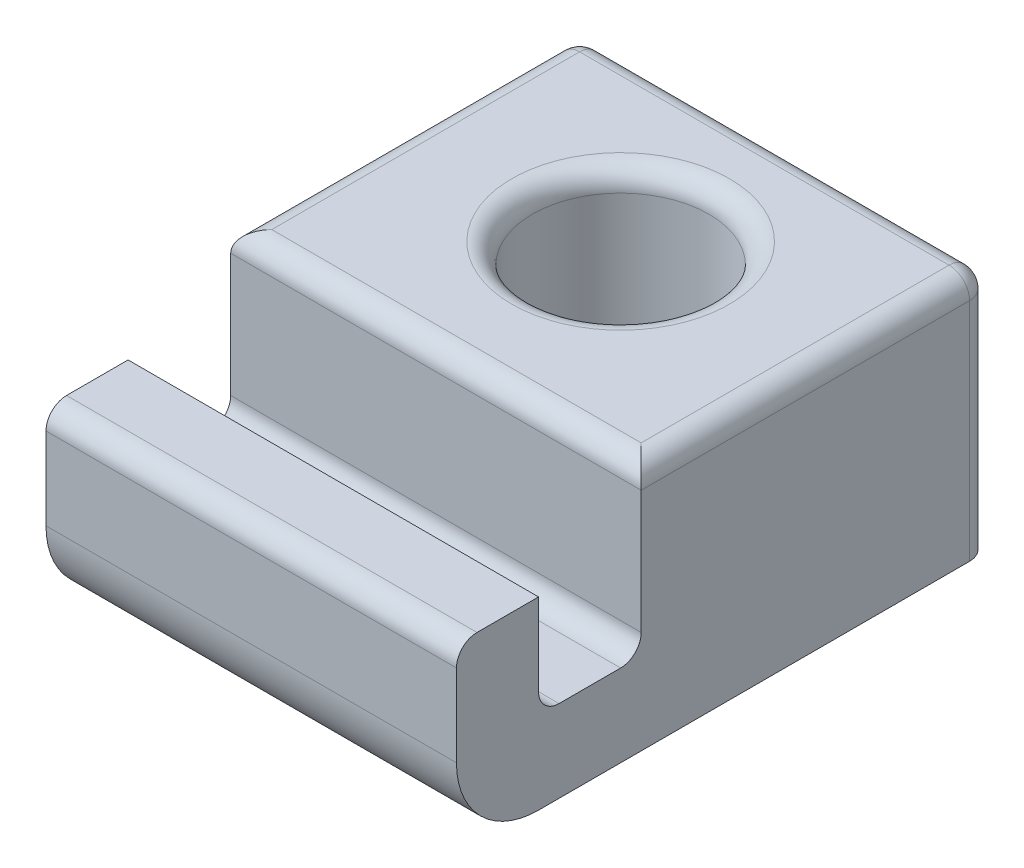
ISO-10303-21;
HEADER;
FILE_DESCRIPTION(('STEP AP214'),'2;1');
FILE_NAME('part.step','',(''),(''),'','','');
FILE_SCHEMA(('AUTOMOTIVE_DESIGN { 1 0 10303 214 1 1 1 1 }'));
ENDSEC;
DATA;
#1=APPLICATION_CONTEXT('core data for automotive mechanical design processes');
#2=APPLICATION_PROTOCOL_DEFINITION('international standard','automotive_design',2000,#1);
#3=PRODUCT_CONTEXT('',#1,'mechanical');
#4=PRODUCT('Part','Part','',(#3));
#5=PRODUCT_RELATED_PRODUCT_CATEGORY('part','',(#4));
#6=PRODUCT_DEFINITION_FORMATION('','',#4);
#7=PRODUCT_DEFINITION_CONTEXT('part definition',#1,'design');
#8=PRODUCT_DEFINITION('design','',#6,#7);
#9=PRODUCT_DEFINITION_SHAPE('','',#8);
#10=(LENGTH_UNIT() NAMED_UNIT(*) SI_UNIT(.MILLI.,.METRE.));
#11=(NAMED_UNIT(*) PLANE_ANGLE_UNIT() SI_UNIT($,.RADIAN.));
#12=(NAMED_UNIT(*) SI_UNIT($,.STERADIAN.) SOLID_ANGLE_UNIT());
#13=UNCERTAINTY_MEASURE_WITH_UNIT(LENGTH_MEASURE(1.E-05),#10,'distance_accuracy_value','');
#14=(GEOMETRIC_REPRESENTATION_CONTEXT(3) GLOBAL_UNCERTAINTY_ASSIGNED_CONTEXT((#13)) GLOBAL_UNIT_ASSIGNED_CONTEXT((#10,
#11,#12)) REPRESENTATION_CONTEXT('',''));
#15=CARTESIAN_POINT('',(0.,0.,0.));
#16=DIRECTION('',(0.,0.,1.));
#17=DIRECTION('',(1.,0.,0.));
#18=AXIS2_PLACEMENT_3D('',#15,#16,#17);
#19=CARTESIAN_POINT('',(0.,2.,0.));
#20=DIRECTION('',(0.,-1.,0.));
#21=DIRECTION('',(0.,0.,-1.));
#22=AXIS2_PLACEMENT_3D('',#19,#20,#21);
#23=PLANE('',#22);
#24=DIRECTION('',(0.,0.,1.));
#25=VECTOR('',#24,1.);
#26=CARTESIAN_POINT('',(-5.,2.,6.5));
#27=LINE('',#26,#25);
#28=CARTESIAN_POINT('',(-5.,2.,2.5));
#29=VERTEX_POINT('',#28);
#30=CARTESIAN_POINT('',(-5.,2.,4.));
#31=VERTEX_POINT('',#30);
#32=EDGE_CURVE('E183',#29,#31,#27,.T.);
#33=ORIENTED_EDGE('',*,*,#32,.T.);
#34=DIRECTION('',(-1.,0.,0.));
#35=VECTOR('',#34,1.);
#36=CARTESIAN_POINT('',(5.,2.,4.));
#37=LINE('',#36,#35);
#38=CARTESIAN_POINT('',(5.,2.,4.));
#39=VERTEX_POINT('',#38);
#40=EDGE_CURVE('E218',#31,#39,#37,.F.);
#41=ORIENTED_EDGE('',*,*,#40,.T.);
#42=DIRECTION('',(0.,0.,-1.));
#43=VECTOR('',#42,1.);
#44=CARTESIAN_POINT('',(5.,2.,6.5));
#45=LINE('',#44,#43);
#46=CARTESIAN_POINT('',(5.,2.,2.5));
#47=VERTEX_POINT('',#46);
#48=EDGE_CURVE('E180',#39,#47,#45,.T.);
#49=ORIENTED_EDGE('',*,*,#48,.T.);
#50=DIRECTION('',(1.,0.,0.));
#51=VECTOR('',#50,1.);
#52=CARTESIAN_POINT('',(-5.,2.,2.5));
#53=LINE('',#52,#51);
#54=EDGE_CURVE('E216',#47,#29,#53,.F.);
#55=ORIENTED_EDGE('',*,*,#54,.T.);
#56=EDGE_LOOP('',(#33,#41,#49,#55));
#57=FACE_BOUND('',#56,.T.);
#58=ADVANCED_FACE('F37',(#57),#23,.F.);
#59=CARTESIAN_POINT('',(5.,2.,6.5));
#60=DIRECTION('',(-1.,0.,0.));
#61=DIRECTION('',(0.,0.,1.));
#62=AXIS2_PLACEMENT_3D('',#59,#60,#61);
#63=PLANE('',#62);
#64=DIRECTION('',(0.,-1.,0.));
#65=VECTOR('',#64,1.);
#66=CARTESIAN_POINT('',(5.,2.,-6.));
#67=LINE('',#66,#65);
#68=CARTESIAN_POINT('',(5.,0.,-6.));
#69=VERTEX_POINT('',#68);
#70=CARTESIAN_POINT('',(5.,5.5,-6.));
#71=VERTEX_POINT('',#70);
#72=EDGE_CURVE('E235',#69,#71,#67,.F.);
#73=ORIENTED_EDGE('',*,*,#72,.T.);
#74=DIRECTION('',(0.,0.,-1.));
#75=VECTOR('',#74,1.);
#76=CARTESIAN_POINT('',(5.,5.5,2.));
#77=LINE('',#76,#75);
#78=CARTESIAN_POINT('',(5.,5.5,2.));
#79=VERTEX_POINT('',#78);
#80=EDGE_CURVE('E237',#71,#79,#77,.F.);
#81=ORIENTED_EDGE('',*,*,#80,.T.);
#82=DIRECTION('',(0.,-1.,0.));
#83=VECTOR('',#82,1.);
#84=CARTESIAN_POINT('',(5.,6.,2.));
#85=LINE('',#84,#83);
#86=CARTESIAN_POINT('',(5.,2.5,2.));
#87=VERTEX_POINT('',#86);
#88=EDGE_CURVE('E383',#79,#87,#85,.T.);
#89=ORIENTED_EDGE('',*,*,#88,.T.);
#90=CARTESIAN_POINT('',(5.,2.5,2.5));
#91=DIRECTION('',(-1.,0.,0.));
#92=DIRECTION('',(0.,0.,1.));
#93=AXIS2_PLACEMENT_3D('',#90,#91,#92);
#94=CIRCLE('',#93,0.5);
#95=EDGE_CURVE('E254',#87,#47,#94,.T.);
#96=ORIENTED_EDGE('',*,*,#95,.T.);
#97=ORIENTED_EDGE('',*,*,#48,.F.);
#98=CARTESIAN_POINT('',(5.,2.5,4.));
#99=DIRECTION('',(-1.,0.,0.));
#100=DIRECTION('',(0.,0.,1.));
#101=AXIS2_PLACEMENT_3D('',#98,#99,#100);
#102=CIRCLE('',#101,0.5);
#103=CARTESIAN_POINT('',(5.,2.5,4.5));
#104=VERTEX_POINT('',#103);
#105=EDGE_CURVE('E166',#39,#104,#102,.T.);
#106=ORIENTED_EDGE('',*,*,#105,.T.);
#107=DIRECTION('',(0.,-1.,0.));
#108=VECTOR('',#107,1.);
#109=CARTESIAN_POINT('',(5.,4.5,4.5));
#110=LINE('',#109,#108);
#111=CARTESIAN_POINT('',(5.,4.5,4.5));
#112=VERTEX_POINT('',#111);
#113=EDGE_CURVE('E162',#112,#104,#110,.T.);
#114=ORIENTED_EDGE('',*,*,#113,.F.);
#115=DIRECTION('',(0.,0.,-1.));
#116=VECTOR('',#115,1.);
#117=CARTESIAN_POINT('',(5.,4.5,6.5));
#118=LINE('',#117,#116);
#119=CARTESIAN_POINT('',(5.,4.5,6.));
#120=VERTEX_POINT('',#119);
#121=EDGE_CURVE('E149',#120,#112,#118,.T.);
#122=ORIENTED_EDGE('',*,*,#121,.F.);
#123=CARTESIAN_POINT('',(5.,4.,6.));
#124=DIRECTION('',(-1.,0.,0.));
#125=DIRECTION('',(0.,0.,1.));
#126=AXIS2_PLACEMENT_3D('',#123,#124,#125);
#127=CIRCLE('',#126,0.5);
#128=CARTESIAN_POINT('',(5.,4.,6.5));
#129=VERTEX_POINT('',#128);
#130=EDGE_CURVE('E208',#120,#129,#127,.F.);
#131=ORIENTED_EDGE('',*,*,#130,.T.);
#132=DIRECTION('',(0.,-1.,0.));
#133=VECTOR('',#132,1.);
#134=CARTESIAN_POINT('',(5.,2.,6.5));
#135=LINE('',#134,#133);
#136=CARTESIAN_POINT('',(5.,2.,6.5));
#137=VERTEX_POINT('',#136);
#138=EDGE_CURVE('E187',#129,#137,#135,.T.);
#139=ORIENTED_EDGE('',*,*,#138,.T.);
#140=CARTESIAN_POINT('',(5.,2.,4.5));
#141=DIRECTION('',(-1.,0.,0.));
#142=DIRECTION('',(0.,0.,1.));
#143=AXIS2_PLACEMENT_3D('',#140,#141,#142);
#144=CIRCLE('',#143,2.);
#145=CARTESIAN_POINT('',(5.,0.,4.5));
#146=VERTEX_POINT('',#145);
#147=EDGE_CURVE('E199',#137,#146,#144,.F.);
#148=ORIENTED_EDGE('',*,*,#147,.T.);
#149=DIRECTION('',(0.,0.,-1.));
#150=VECTOR('',#149,1.);
#151=CARTESIAN_POINT('',(5.,0.,6.5));
#152=LINE('',#151,#150);
#153=EDGE_CURVE('E170',#146,#69,#152,.T.);
#154=ORIENTED_EDGE('',*,*,#153,.T.);
#155=EDGE_LOOP('',(#73,#81,#89,#96,#97,#106,#114,#122,#131,#139,#148,#154));
#156=FACE_BOUND('',#155,.T.);
#157=ADVANCED_FACE('F163',(#156),#63,.F.);
#158=CARTESIAN_POINT('',(-5.,2.,-6.5));
#159=DIRECTION('',(0.,0.,1.));
#160=DIRECTION('',(1.,0.,0.));
#161=AXIS2_PLACEMENT_3D('',#158,#159,#160);
#162=PLANE('',#161);
#163=DIRECTION('',(-1.,0.,0.));
#164=VECTOR('',#163,1.);
#165=CARTESIAN_POINT('',(5.,5.5,-6.5));
#166=LINE('',#165,#164);
#167=CARTESIAN_POINT('',(-4.5,5.5,-6.5));
#168=VERTEX_POINT('',#167);
#169=CARTESIAN_POINT('',(4.5,5.5,-6.5));
#170=VERTEX_POINT('',#169);
#171=EDGE_CURVE('E52',#168,#170,#166,.F.);
#172=ORIENTED_EDGE('',*,*,#171,.T.);
#173=DIRECTION('',(0.,-1.,0.));
#174=VECTOR('',#173,1.);
#175=CARTESIAN_POINT('',(4.5,2.,-6.5));
#176=LINE('',#175,#174);
#177=CARTESIAN_POINT('',(4.5,0.,-6.5));
#178=VERTEX_POINT('',#177);
#179=EDGE_CURVE('E245',#170,#178,#176,.T.);
#180=ORIENTED_EDGE('',*,*,#179,.T.);
#181=DIRECTION('',(-1.,0.,0.));
#182=VECTOR('',#181,1.);
#183=CARTESIAN_POINT('',(-5.,0.,-6.5));
#184=LINE('',#183,#182);
#185=CARTESIAN_POINT('',(-4.5,0.,-6.5));
#186=VERTEX_POINT('',#185);
#187=EDGE_CURVE('E190',#178,#186,#184,.T.);
#188=ORIENTED_EDGE('',*,*,#187,.T.);
#189=DIRECTION('',(0.,-1.,0.));
#190=VECTOR('',#189,1.);
#191=CARTESIAN_POINT('',(-4.5,2.,-6.5));
#192=LINE('',#191,#190);
#193=EDGE_CURVE('E57',#186,#168,#192,.F.);
#194=ORIENTED_EDGE('',*,*,#193,.T.);
#195=EDGE_LOOP('',(#172,#180,#188,#194));
#196=FACE_BOUND('',#195,.T.);
#197=ADVANCED_FACE('F302',(#196),#162,.F.);
#198=CARTESIAN_POINT('',(-5.,2.,6.5));
#199=DIRECTION('',(1.,0.,0.));
#200=DIRECTION('',(0.,0.,-1.));
#201=AXIS2_PLACEMENT_3D('',#198,#199,#200);
#202=PLANE('',#201);
#203=DIRECTION('',(0.,-1.,0.));
#204=VECTOR('',#203,1.);
#205=CARTESIAN_POINT('',(-5.,6.,2.));
#206=LINE('',#205,#204);
#207=CARTESIAN_POINT('',(-5.,5.5,2.));
#208=VERTEX_POINT('',#207);
#209=CARTESIAN_POINT('',(-5.,2.5,2.));
#210=VERTEX_POINT('',#209);
#211=EDGE_CURVE('E389',#208,#210,#206,.T.);
#212=ORIENTED_EDGE('',*,*,#211,.F.);
#213=DIRECTION('',(0.,0.,1.));
#214=VECTOR('',#213,1.);
#215=CARTESIAN_POINT('',(-5.,5.5,-6.5));
#216=LINE('',#215,#214);
#217=CARTESIAN_POINT('',(-5.,5.5,-6.));
#218=VERTEX_POINT('',#217);
#219=EDGE_CURVE('E241',#208,#218,#216,.F.);
#220=ORIENTED_EDGE('',*,*,#219,.T.);
#221=DIRECTION('',(0.,-1.,0.));
#222=VECTOR('',#221,1.);
#223=CARTESIAN_POINT('',(-5.,2.,-6.));
#224=LINE('',#223,#222);
#225=CARTESIAN_POINT('',(-5.,0.,-6.));
#226=VERTEX_POINT('',#225);
#227=EDGE_CURVE('E239',#218,#226,#224,.T.);
#228=ORIENTED_EDGE('',*,*,#227,.T.);
#229=DIRECTION('',(0.,0.,1.));
#230=VECTOR('',#229,1.);
#231=CARTESIAN_POINT('',(-5.,0.,6.5));
#232=LINE('',#231,#230);
#233=CARTESIAN_POINT('',(-5.,0.,4.5));
#234=VERTEX_POINT('',#233);
#235=EDGE_CURVE('E184',#226,#234,#232,.T.);
#236=ORIENTED_EDGE('',*,*,#235,.T.);
#237=CARTESIAN_POINT('',(-5.,2.,4.5));
#238=DIRECTION('',(1.,0.,0.));
#239=DIRECTION('',(0.,0.,-1.));
#240=AXIS2_PLACEMENT_3D('',#237,#238,#239);
#241=CIRCLE('',#240,2.);
#242=CARTESIAN_POINT('',(-5.,2.,6.5));
#243=VERTEX_POINT('',#242);
#244=EDGE_CURVE('E204',#234,#243,#241,.F.);
#245=ORIENTED_EDGE('',*,*,#244,.T.);
#246=DIRECTION('',(0.,-1.,0.));
#247=VECTOR('',#246,1.);
#248=CARTESIAN_POINT('',(-5.,2.,6.5));
#249=LINE('',#248,#247);
#250=CARTESIAN_POINT('',(-5.,4.,6.5));
#251=VERTEX_POINT('',#250);
#252=EDGE_CURVE('E194',#251,#243,#249,.T.);
#253=ORIENTED_EDGE('',*,*,#252,.F.);
#254=CARTESIAN_POINT('',(-5.,4.,6.));
#255=DIRECTION('',(1.,0.,0.));
#256=DIRECTION('',(0.,0.,-1.));
#257=AXIS2_PLACEMENT_3D('',#254,#255,#256);
#258=CIRCLE('',#257,0.5);
#259=CARTESIAN_POINT('',(-5.,4.5,6.));
#260=VERTEX_POINT('',#259);
#261=EDGE_CURVE('E212',#251,#260,#258,.F.);
#262=ORIENTED_EDGE('',*,*,#261,.T.);
#263=DIRECTION('',(0.,0.,1.));
#264=VECTOR('',#263,1.);
#265=CARTESIAN_POINT('',(-5.,4.5,6.5));
#266=LINE('',#265,#264);
#267=CARTESIAN_POINT('',(-5.,4.5,4.5));
#268=VERTEX_POINT('',#267);
#269=EDGE_CURVE('E159',#268,#260,#266,.T.);
#270=ORIENTED_EDGE('',*,*,#269,.F.);
#271=DIRECTION('',(0.,-1.,0.));
#272=VECTOR('',#271,1.);
#273=CARTESIAN_POINT('',(-5.,4.5,4.5));
#274=LINE('',#273,#272);
#275=CARTESIAN_POINT('',(-5.,2.5,4.5));
#276=VERTEX_POINT('',#275);
#277=EDGE_CURVE('E171',#268,#276,#274,.T.);
#278=ORIENTED_EDGE('',*,*,#277,.T.);
#279=CARTESIAN_POINT('',(-5.,2.5,4.));
#280=DIRECTION('',(1.,0.,0.));
#281=DIRECTION('',(0.,0.,-1.));
#282=AXIS2_PLACEMENT_3D('',#279,#280,#281);
#283=CIRCLE('',#282,0.5);
#284=EDGE_CURVE('E251',#276,#31,#283,.T.);
#285=ORIENTED_EDGE('',*,*,#284,.T.);
#286=ORIENTED_EDGE('',*,*,#32,.F.);
#287=CARTESIAN_POINT('',(-5.,2.5,2.5));
#288=DIRECTION('',(1.,0.,0.));
#289=DIRECTION('',(0.,0.,-1.));
#290=AXIS2_PLACEMENT_3D('',#287,#288,#289);
#291=CIRCLE('',#290,0.5);
#292=EDGE_CURVE('E256',#29,#210,#291,.T.);
#293=ORIENTED_EDGE('',*,*,#292,.T.);
#294=EDGE_LOOP('',(#212,#220,#228,#236,#245,#253,#262,#270,#278,#285,#286,#293));
#295=FACE_BOUND('',#294,.T.);
#296=ADVANCED_FACE('F314',(#295),#202,.F.);
#297=CARTESIAN_POINT('',(-5.,2.,6.5));
#298=DIRECTION('',(0.,0.,-1.));
#299=DIRECTION('',(-1.,0.,0.));
#300=AXIS2_PLACEMENT_3D('',#297,#298,#299);
#301=PLANE('',#300);
#302=ORIENTED_EDGE('',*,*,#138,.F.);
#303=DIRECTION('',(1.,0.,0.));
#304=VECTOR('',#303,1.);
#305=CARTESIAN_POINT('',(-5.,4.,6.5));
#306=LINE('',#305,#304);
#307=EDGE_CURVE('E210',#129,#251,#306,.F.);
#308=ORIENTED_EDGE('',*,*,#307,.T.);
#309=ORIENTED_EDGE('',*,*,#252,.T.);
#310=DIRECTION('',(1.,0.,0.));
#311=VECTOR('',#310,1.);
#312=CARTESIAN_POINT('',(5.,2.,6.5));
#313=LINE('',#312,#311);
#314=EDGE_CURVE('E196',#243,#137,#313,.T.);
#315=ORIENTED_EDGE('',*,*,#314,.T.);
#316=EDGE_LOOP('',(#302,#308,#309,#315));
#317=FACE_BOUND('',#316,.T.);
#318=ADVANCED_FACE('F310',(#317),#301,.F.);
#319=CARTESIAN_POINT('',(0.,0.,0.));
#320=DIRECTION('',(0.,-1.,0.));
#321=DIRECTION('',(0.,0.,-1.));
#322=AXIS2_PLACEMENT_3D('',#319,#320,#321);
#323=PLANE('',#322);
#324=CARTESIAN_POINT('',(0.,0.,-2.5));
#325=DIRECTION('',(0.,-1.,0.));
#326=DIRECTION('',(0.,0.,-1.));
#327=AXIS2_PLACEMENT_3D('',#324,#325,#326);
#328=CIRCLE('',#327,2.15);
#329=CARTESIAN_POINT('',(0.,0.,-0.35));
#330=VERTEX_POINT('',#329);
#331=EDGE_CURVE('E279',#330,#330,#328,.F.);
#332=ORIENTED_EDGE('',*,*,#331,.T.);
#333=EDGE_LOOP('',(#332));
#334=FACE_BOUND('',#333,.T.);
#335=ORIENTED_EDGE('',*,*,#187,.F.);
#336=CARTESIAN_POINT('',(4.5,0.,-6.));
#337=DIRECTION('',(0.,-1.,0.));
#338=DIRECTION('',(0.,0.,-1.));
#339=AXIS2_PLACEMENT_3D('',#336,#337,#338);
#340=CIRCLE('',#339,0.5);
#341=EDGE_CURVE('E249',#178,#69,#340,.T.);
#342=ORIENTED_EDGE('',*,*,#341,.T.);
#343=ORIENTED_EDGE('',*,*,#153,.F.);
#344=DIRECTION('',(1.,0.,0.));
#345=VECTOR('',#344,1.);
#346=CARTESIAN_POINT('',(-5.,0.,4.5));
#347=LINE('',#346,#345);
#348=EDGE_CURVE('E201',#146,#234,#347,.F.);
#349=ORIENTED_EDGE('',*,*,#348,.T.);
#350=ORIENTED_EDGE('',*,*,#235,.F.);
#351=CARTESIAN_POINT('',(-4.5,0.,-6.));
#352=DIRECTION('',(0.,-1.,0.));
#353=DIRECTION('',(0.,0.,-1.));
#354=AXIS2_PLACEMENT_3D('',#351,#352,#353);
#355=CIRCLE('',#354,0.5);
#356=EDGE_CURVE('E247',#226,#186,#355,.T.);
#357=ORIENTED_EDGE('',*,*,#356,.T.);
#358=EDGE_LOOP('',(#335,#342,#343,#349,#350,#357));
#359=FACE_BOUND('',#358,.T.);
#360=ADVANCED_FACE('F307',(#334,#359),#323,.T.);
#361=CARTESIAN_POINT('',(-5.,4.5,4.5));
#362=DIRECTION('',(0.,0.,1.));
#363=DIRECTION('',(1.,0.,0.));
#364=AXIS2_PLACEMENT_3D('',#361,#362,#363);
#365=PLANE('',#364);
#366=ORIENTED_EDGE('',*,*,#113,.T.);
#367=DIRECTION('',(-1.,0.,0.));
#368=VECTOR('',#367,1.);
#369=CARTESIAN_POINT('',(-5.,2.5,4.5));
#370=LINE('',#369,#368);
#371=EDGE_CURVE('E214',#104,#276,#370,.T.);
#372=ORIENTED_EDGE('',*,*,#371,.T.);
#373=ORIENTED_EDGE('',*,*,#277,.F.);
#374=DIRECTION('',(-1.,0.,0.));
#375=VECTOR('',#374,1.);
#376=CARTESIAN_POINT('',(-5.,4.5,4.5));
#377=LINE('',#376,#375);
#378=EDGE_CURVE('E154',#112,#268,#377,.T.);
#379=ORIENTED_EDGE('',*,*,#378,.F.);
#380=EDGE_LOOP('',(#366,#372,#373,#379));
#381=FACE_BOUND('',#380,.T.);
#382=ADVANCED_FACE('F173',(#381),#365,.F.);
#383=CARTESIAN_POINT('',(0.,4.5,0.));
#384=DIRECTION('',(0.,-1.,0.));
#385=DIRECTION('',(0.,0.,-1.));
#386=AXIS2_PLACEMENT_3D('',#383,#384,#385);
#387=PLANE('',#386);
#388=ORIENTED_EDGE('',*,*,#269,.T.);
#389=DIRECTION('',(1.,0.,0.));
#390=VECTOR('',#389,1.);
#391=CARTESIAN_POINT('',(0.,4.5,6.));
#392=LINE('',#391,#390);
#393=EDGE_CURVE('E157',#260,#120,#392,.T.);
#394=ORIENTED_EDGE('',*,*,#393,.T.);
#395=ORIENTED_EDGE('',*,*,#121,.T.);
#396=ORIENTED_EDGE('',*,*,#378,.T.);
#397=EDGE_LOOP('',(#388,#394,#395,#396));
#398=FACE_BOUND('',#397,.T.);
#399=ADVANCED_FACE('F152',(#398),#387,.F.);
#400=CARTESIAN_POINT('',(-5.,2.,4.5));
#401=DIRECTION('',(-1.,0.,0.));
#402=DIRECTION('',(0.,0.,1.));
#403=AXIS2_PLACEMENT_3D('',#400,#401,#402);
#404=CYLINDRICAL_SURFACE('',#403,2.);
#405=ORIENTED_EDGE('',*,*,#244,.F.);
#406=ORIENTED_EDGE('',*,*,#348,.F.);
#407=ORIENTED_EDGE('',*,*,#147,.F.);
#408=ORIENTED_EDGE('',*,*,#314,.F.);
#409=EDGE_LOOP('',(#405,#406,#407,#408));
#410=FACE_BOUND('',#409,.T.);
#411=ADVANCED_FACE('F321',(#410),#404,.T.);
#412=CARTESIAN_POINT('',(0.,4.,6.));
#413=DIRECTION('',(1.,0.,0.));
#414=DIRECTION('',(0.,0.,-1.));
#415=AXIS2_PLACEMENT_3D('',#412,#413,#414);
#416=CYLINDRICAL_SURFACE('',#415,0.5);
#417=ORIENTED_EDGE('',*,*,#261,.F.);
#418=ORIENTED_EDGE('',*,*,#307,.F.);
#419=ORIENTED_EDGE('',*,*,#130,.F.);
#420=ORIENTED_EDGE('',*,*,#393,.F.);
#421=EDGE_LOOP('',(#417,#418,#419,#420));
#422=FACE_BOUND('',#421,.T.);
#423=ADVANCED_FACE('F324',(#422),#416,.T.);
#424=CARTESIAN_POINT('',(-5.,6.,2.));
#425=DIRECTION('',(0.,0.,-1.));
#426=DIRECTION('',(-1.,0.,0.));
#427=AXIS2_PLACEMENT_3D('',#424,#425,#426);
#428=PLANE('',#427);
#429=ORIENTED_EDGE('',*,*,#211,.T.);
#430=DIRECTION('',(1.,0.,0.));
#431=VECTOR('',#430,1.);
#432=CARTESIAN_POINT('',(5.,2.5,2.));
#433=LINE('',#432,#431);
#434=EDGE_CURVE('E223',#210,#87,#433,.T.);
#435=ORIENTED_EDGE('',*,*,#434,.T.);
#436=ORIENTED_EDGE('',*,*,#88,.F.);
#437=DIRECTION('',(1.,0.,0.));
#438=VECTOR('',#437,1.);
#439=CARTESIAN_POINT('',(-5.,5.5,2.));
#440=LINE('',#439,#438);
#441=EDGE_CURVE('E220',#79,#208,#440,.F.);
#442=ORIENTED_EDGE('',*,*,#441,.T.);
#443=EDGE_LOOP('',(#429,#435,#436,#442));
#444=FACE_BOUND('',#443,.T.);
#445=ADVANCED_FACE('F328',(#444),#428,.F.);
#446=CARTESIAN_POINT('',(0.,6.,0.));
#447=DIRECTION('',(0.,1.,0.));
#448=DIRECTION('',(0.,0.,1.));
#449=AXIS2_PLACEMENT_3D('',#446,#447,#448);
#450=PLANE('',#449);
#451=CARTESIAN_POINT('',(0.,6.,-2.5));
#452=DIRECTION('',(0.,1.,0.));
#453=DIRECTION('',(0.,0.,1.));
#454=AXIS2_PLACEMENT_3D('',#451,#452,#453);
#455=CIRCLE('',#454,2.65);
#456=CARTESIAN_POINT('',(0.,6.,0.15));
#457=VERTEX_POINT('',#456);
#458=EDGE_CURVE('E11',#457,#457,#455,.F.);
#459=ORIENTED_EDGE('',*,*,#458,.T.);
#460=EDGE_LOOP('',(#459));
#461=FACE_BOUND('',#460,.T.);
#462=DIRECTION('',(0.,0.,1.));
#463=VECTOR('',#462,1.);
#464=CARTESIAN_POINT('',(-4.5,6.,2.));
#465=LINE('',#464,#463);
#466=CARTESIAN_POINT('',(-4.5,6.,-6.));
#467=VERTEX_POINT('',#466);
#468=CARTESIAN_POINT('',(-4.5,6.,1.5));
#469=VERTEX_POINT('',#468);
#470=EDGE_CURVE('E228',#467,#469,#465,.T.);
#471=ORIENTED_EDGE('',*,*,#470,.T.);
#472=DIRECTION('',(1.,0.,0.));
#473=VECTOR('',#472,1.);
#474=CARTESIAN_POINT('',(5.,6.,1.5));
#475=LINE('',#474,#473);
#476=CARTESIAN_POINT('',(4.5,6.,1.5));
#477=VERTEX_POINT('',#476);
#478=EDGE_CURVE('E232',#469,#477,#475,.T.);
#479=ORIENTED_EDGE('',*,*,#478,.T.);
#480=DIRECTION('',(0.,0.,-1.));
#481=VECTOR('',#480,1.);
#482=CARTESIAN_POINT('',(4.5,6.,-6.5));
#483=LINE('',#482,#481);
#484=CARTESIAN_POINT('',(4.5,6.,-6.));
#485=VERTEX_POINT('',#484);
#486=EDGE_CURVE('E230',#477,#485,#483,.T.);
#487=ORIENTED_EDGE('',*,*,#486,.T.);
#488=DIRECTION('',(-1.,0.,0.));
#489=VECTOR('',#488,1.);
#490=CARTESIAN_POINT('',(-5.,6.,-6.));
#491=LINE('',#490,#489);
#492=EDGE_CURVE('E226',#485,#467,#491,.T.);
#493=ORIENTED_EDGE('',*,*,#492,.T.);
#494=EDGE_LOOP('',(#471,#479,#487,#493));
#495=FACE_BOUND('',#494,.T.);
#496=ADVANCED_FACE('F403',(#461,#495),#450,.T.);
#497=CARTESIAN_POINT('',(0.,-0.00100000000000013,-2.5));
#498=DIRECTION('',(0.,1.,0.));
#499=DIRECTION('',(0.,0.,1.));
#500=AXIS2_PLACEMENT_3D('',#497,#498,#499);
#501=CYLINDRICAL_SURFACE('',#500,2.15);
#502=CARTESIAN_POINT('',(0.,5.5,-2.5));
#503=DIRECTION('',(0.,1.,0.));
#504=DIRECTION('',(0.,0.,1.));
#505=AXIS2_PLACEMENT_3D('',#502,#503,#504);
#506=CIRCLE('',#505,2.15);
#507=CARTESIAN_POINT('',(0.,5.5,-0.35));
#508=VERTEX_POINT('',#507);
#509=EDGE_CURVE('E45',#508,#508,#506,.T.);
#510=CARTESIAN_POINT('',(0.,5.5,-0.35));
#511=CARTESIAN_POINT('',(0.,5.44270833333333,-0.35));
#512=CARTESIAN_POINT('',(0.,5.38541666666667,-0.35));
#513=CARTESIAN_POINT('',(0.,5.27083333333333,-0.35));
#514=CARTESIAN_POINT('',(0.,5.21354166666667,-0.35));
#515=CARTESIAN_POINT('',(0.,5.09895833333333,-0.35));
#516=CARTESIAN_POINT('',(0.,5.04166666666667,-0.35));
#517=CARTESIAN_POINT('',(0.,4.92708333333333,-0.35));
#518=CARTESIAN_POINT('',(0.,4.86979166666667,-0.35));
#519=CARTESIAN_POINT('',(0.,4.75520833333333,-0.35));
#520=CARTESIAN_POINT('',(0.,4.69791666666667,-0.35));
#521=CARTESIAN_POINT('',(0.,4.58333333333333,-0.35));
#522=CARTESIAN_POINT('',(0.,4.52604166666667,-0.35));
#523=CARTESIAN_POINT('',(0.,4.41145833333333,-0.35));
#524=CARTESIAN_POINT('',(0.,4.35416666666667,-0.35));
#525=CARTESIAN_POINT('',(0.,4.23958333333333,-0.35));
#526=CARTESIAN_POINT('',(0.,4.18229166666667,-0.35));
#527=CARTESIAN_POINT('',(0.,4.06770833333333,-0.35));
#528=CARTESIAN_POINT('',(0.,4.01041666666667,-0.35));
#529=CARTESIAN_POINT('',(0.,3.89583333333333,-0.35));
#530=CARTESIAN_POINT('',(0.,3.83854166666667,-0.35));
#531=CARTESIAN_POINT('',(0.,3.72395833333333,-0.35));
#532=CARTESIAN_POINT('',(0.,3.66666666666667,-0.35));
#533=CARTESIAN_POINT('',(0.,3.55208333333333,-0.35));
#534=CARTESIAN_POINT('',(0.,3.49479166666667,-0.35));
#535=CARTESIAN_POINT('',(0.,3.38020833333333,-0.35));
#536=CARTESIAN_POINT('',(0.,3.32291666666667,-0.35));
#537=CARTESIAN_POINT('',(0.,3.20833333333333,-0.35));
#538=CARTESIAN_POINT('',(0.,3.15104166666667,-0.35));
#539=CARTESIAN_POINT('',(0.,3.03645833333333,-0.35));
#540=CARTESIAN_POINT('',(0.,2.97916666666667,-0.35));
#541=CARTESIAN_POINT('',(0.,2.86458333333333,-0.35));
#542=CARTESIAN_POINT('',(0.,2.80729166666667,-0.35));
#543=CARTESIAN_POINT('',(0.,2.69270833333333,-0.35));
#544=CARTESIAN_POINT('',(0.,2.63541666666667,-0.35));
#545=CARTESIAN_POINT('',(0.,2.52083333333333,-0.35));
#546=CARTESIAN_POINT('',(0.,2.46354166666667,-0.35));
#547=CARTESIAN_POINT('',(0.,2.34895833333333,-0.35));
#548=CARTESIAN_POINT('',(0.,2.29166666666667,-0.35));
#549=CARTESIAN_POINT('',(0.,2.17708333333333,-0.35));
#550=CARTESIAN_POINT('',(0.,2.11979166666667,-0.35));
#551=CARTESIAN_POINT('',(0.,2.00520833333333,-0.35));
#552=CARTESIAN_POINT('',(0.,1.94791666666667,-0.35));
#553=CARTESIAN_POINT('',(0.,1.83333333333333,-0.35));
#554=CARTESIAN_POINT('',(0.,1.77604166666667,-0.35));
#555=CARTESIAN_POINT('',(0.,1.66145833333333,-0.35));
#556=CARTESIAN_POINT('',(0.,1.60416666666667,-0.35));
#557=CARTESIAN_POINT('',(0.,1.48958333333333,-0.35));
#558=CARTESIAN_POINT('',(0.,1.43229166666667,-0.35));
#559=CARTESIAN_POINT('',(0.,1.31770833333333,-0.35));
#560=CARTESIAN_POINT('',(0.,1.26041666666667,-0.35));
#561=CARTESIAN_POINT('',(0.,1.14583333333333,-0.35));
#562=CARTESIAN_POINT('',(0.,1.08854166666667,-0.35));
#563=CARTESIAN_POINT('',(0.,0.973958333333333,-0.35));
#564=CARTESIAN_POINT('',(0.,0.916666666666666,-0.35));
#565=CARTESIAN_POINT('',(0.,0.802083333333333,-0.35));
#566=CARTESIAN_POINT('',(0.,0.744791666666666,-0.35));
#567=CARTESIAN_POINT('',(0.,0.630208333333333,-0.35));
#568=CARTESIAN_POINT('',(0.,0.572916666666667,-0.35));
#569=CARTESIAN_POINT('',(0.,0.458333333333334,-0.35));
#570=CARTESIAN_POINT('',(0.,0.401041666666667,-0.35));
#571=CARTESIAN_POINT('',(0.,0.286458333333334,-0.35));
#572=CARTESIAN_POINT('',(0.,0.229166666666667,-0.35));
#573=CARTESIAN_POINT('',(0.,0.114583333333333,-0.35));
#574=CARTESIAN_POINT('',(0.,0.0572916666666668,-0.35));
#575=CARTESIAN_POINT('',(0.,0.,-0.35));
#576=B_SPLINE_CURVE_WITH_KNOTS('',3,(#510,#511,#512,#513,#514,#515,#516,#517,#518,#519,#520,
#521,#522,#523,#524,#525,#526,#527,#528,#529,#530,#531,#532,#533,#534,#535,#536,#537,#538,#539,
#540,#541,#542,#543,#544,#545,#546,#547,#548,#549,#550,#551,#552,#553,#554,#555,#556,#557,#558,
#559,#560,#561,#562,#563,#564,#565,#566,#567,#568,#569,#570,#571,#572,#573,#574,#575),
.UNSPECIFIED.,.F.,.F.,(4,2,2,2,2,2,2,2,2,2,2,2,2,2,2,2,2,2,2,2,2,2,2,2,2,2,2,2,2,2,2,2,4),(0.,
0.171875,0.34375,0.515625,0.6875,0.859375,1.03125,1.203125,1.375,1.546875,1.71875,1.890625,
2.0625,2.234375,2.40625,2.578125,2.75,2.921875,3.09375,3.265625,3.4375,3.609375,3.78125,
3.953125,4.125,4.296875,4.46875,4.640625,4.8125,4.984375,5.15625,5.328125,5.5),.UNSPECIFIED.);
#577=EDGE_CURVE('BSEAM283',#508,#330,#576,.T.);
#578=ORIENTED_EDGE('',*,*,#509,.T.);
#579=ORIENTED_EDGE('',*,*,#331,.F.);
#580=ORIENTED_EDGE('',*,*,#577,.T.);
#581=ORIENTED_EDGE('',*,*,#577,.F.);
#582=EDGE_LOOP('',(#578,#580,#579,#581));
#583=FACE_BOUND('',#582,.T.);
#584=ADVANCED_FACE('F283',(#583),#501,.F.);
#585=CARTESIAN_POINT('',(-5.,2.5,4.));
#586=DIRECTION('',(1.,0.,0.));
#587=DIRECTION('',(0.,0.,-1.));
#588=AXIS2_PLACEMENT_3D('',#585,#586,#587);
#589=CYLINDRICAL_SURFACE('',#588,0.5);
#590=ORIENTED_EDGE('',*,*,#105,.F.);
#591=ORIENTED_EDGE('',*,*,#40,.F.);
#592=ORIENTED_EDGE('',*,*,#284,.F.);
#593=ORIENTED_EDGE('',*,*,#371,.F.);
#594=EDGE_LOOP('',(#590,#591,#592,#593));
#595=FACE_BOUND('',#594,.T.);
#596=ADVANCED_FACE('F330',(#595),#589,.F.);
#597=CARTESIAN_POINT('',(-5.,2.5,2.5));
#598=DIRECTION('',(-1.,0.,0.));
#599=DIRECTION('',(0.,0.,1.));
#600=AXIS2_PLACEMENT_3D('',#597,#598,#599);
#601=CYLINDRICAL_SURFACE('',#600,0.5);
#602=ORIENTED_EDGE('',*,*,#292,.F.);
#603=ORIENTED_EDGE('',*,*,#54,.F.);
#604=ORIENTED_EDGE('',*,*,#95,.F.);
#605=ORIENTED_EDGE('',*,*,#434,.F.);
#606=EDGE_LOOP('',(#602,#603,#604,#605));
#607=FACE_BOUND('',#606,.T.);
#608=ADVANCED_FACE('F333',(#607),#601,.F.);
#609=CARTESIAN_POINT('',(-4.5,2.,-6.));
#610=DIRECTION('',(0.,-1.,0.));
#611=DIRECTION('',(0.,0.,-1.));
#612=AXIS2_PLACEMENT_3D('',#609,#610,#611);
#613=CYLINDRICAL_SURFACE('',#612,0.5);
#614=ORIENTED_EDGE('',*,*,#356,.F.);
#615=ORIENTED_EDGE('',*,*,#227,.F.);
#616=CARTESIAN_POINT('',(-4.5,5.5,-6.));
#617=DIRECTION('',(0.,1.,0.));
#618=DIRECTION('',(0.,0.,1.));
#619=AXIS2_PLACEMENT_3D('',#616,#617,#618);
#620=CIRCLE('',#619,0.5);
#621=EDGE_CURVE('E277',#168,#218,#620,.T.);
#622=ORIENTED_EDGE('',*,*,#621,.F.);
#623=ORIENTED_EDGE('',*,*,#193,.F.);
#624=EDGE_LOOP('',(#614,#615,#622,#623));
#625=FACE_BOUND('',#624,.T.);
#626=ADVANCED_FACE('F336',(#625),#613,.T.);
#627=CARTESIAN_POINT('',(0.,5.5,-6.));
#628=DIRECTION('',(1.,0.,0.));
#629=DIRECTION('',(0.,0.,-1.));
#630=AXIS2_PLACEMENT_3D('',#627,#628,#629);
#631=CYLINDRICAL_SURFACE('',#630,0.5);
#632=CARTESIAN_POINT('',(4.5,5.5,-6.));
#633=DIRECTION('',(1.,0.,0.));
#634=DIRECTION('',(0.,0.,-1.));
#635=AXIS2_PLACEMENT_3D('',#632,#633,#634);
#636=CIRCLE('',#635,0.5);
#637=EDGE_CURVE('E271',#170,#485,#636,.T.);
#638=ORIENTED_EDGE('',*,*,#637,.F.);
#639=ORIENTED_EDGE('',*,*,#171,.F.);
#640=CARTESIAN_POINT('',(-4.5,5.5,-6.));
#641=DIRECTION('',(-1.,0.,0.));
#642=DIRECTION('',(0.,0.,1.));
#643=AXIS2_PLACEMENT_3D('',#640,#641,#642);
#644=CIRCLE('',#643,0.5);
#645=EDGE_CURVE('E274',#467,#168,#644,.T.);
#646=ORIENTED_EDGE('',*,*,#645,.F.);
#647=ORIENTED_EDGE('',*,*,#492,.F.);
#648=EDGE_LOOP('',(#638,#639,#646,#647));
#649=FACE_BOUND('',#648,.T.);
#650=ADVANCED_FACE('F357',(#649),#631,.T.);
#651=CARTESIAN_POINT('',(4.5,2.,-6.));
#652=DIRECTION('',(0.,-1.,0.));
#653=DIRECTION('',(0.,0.,-1.));
#654=AXIS2_PLACEMENT_3D('',#651,#652,#653);
#655=CYLINDRICAL_SURFACE('',#654,0.5);
#656=ORIENTED_EDGE('',*,*,#341,.F.);
#657=ORIENTED_EDGE('',*,*,#179,.F.);
#658=CARTESIAN_POINT('',(4.5,5.5,-6.));
#659=DIRECTION('',(0.,1.,0.));
#660=DIRECTION('',(0.,0.,1.));
#661=AXIS2_PLACEMENT_3D('',#658,#659,#660);
#662=CIRCLE('',#661,0.5);
#663=EDGE_CURVE('E268',#71,#170,#662,.T.);
#664=ORIENTED_EDGE('',*,*,#663,.F.);
#665=ORIENTED_EDGE('',*,*,#72,.F.);
#666=EDGE_LOOP('',(#656,#657,#664,#665));
#667=FACE_BOUND('',#666,.T.);
#668=ADVANCED_FACE('F353',(#667),#655,.T.);
#669=CARTESIAN_POINT('',(-4.5,5.5,-6.));
#670=DIRECTION('',(0.,0.,-1.));
#671=DIRECTION('',(-1.,0.,0.));
#672=AXIS2_PLACEMENT_3D('',#669,#670,#671);
#673=SPHERICAL_SURFACE('',#672,0.5);
#674=ORIENTED_EDGE('',*,*,#645,.T.);
#675=ORIENTED_EDGE('',*,*,#621,.T.);
#676=CARTESIAN_POINT('',(-4.5,5.5,-6.));
#677=DIRECTION('',(0.,0.,-1.));
#678=DIRECTION('',(0.,1.,0.));
#679=AXIS2_PLACEMENT_3D('',#676,#677,#678);
#680=CIRCLE('',#679,0.5);
#681=EDGE_CURVE('E265',#467,#218,#680,.F.);
#682=ORIENTED_EDGE('',*,*,#681,.F.);
#683=EDGE_LOOP('',(#674,#675,#682));
#684=FACE_BOUND('',#683,.T.);
#685=ADVANCED_FACE('F349',(#684),#673,.T.);
#686=CARTESIAN_POINT('',(4.5,5.5,-6.));
#687=DIRECTION('',(0.,0.,-1.));
#688=DIRECTION('',(-1.,0.,0.));
#689=AXIS2_PLACEMENT_3D('',#686,#687,#688);
#690=SPHERICAL_SURFACE('',#689,0.5);
#691=ORIENTED_EDGE('',*,*,#663,.T.);
#692=ORIENTED_EDGE('',*,*,#637,.T.);
#693=CARTESIAN_POINT('',(4.5,5.5,-6.));
#694=DIRECTION('',(0.,0.,-1.));
#695=DIRECTION('',(-1.,0.,0.));
#696=AXIS2_PLACEMENT_3D('',#693,#694,#695);
#697=CIRCLE('',#696,0.5);
#698=EDGE_CURVE('E262',#71,#485,#697,.F.);
#699=ORIENTED_EDGE('',*,*,#698,.F.);
#700=EDGE_LOOP('',(#691,#692,#699));
#701=FACE_BOUND('',#700,.T.);
#702=ADVANCED_FACE('F345',(#701),#690,.T.);
#703=CARTESIAN_POINT('',(-4.5,5.5,0.));
#704=DIRECTION('',(0.,0.,-1.));
#705=DIRECTION('',(-1.,0.,0.));
#706=AXIS2_PLACEMENT_3D('',#703,#704,#705);
#707=CYLINDRICAL_SURFACE('',#706,0.5);
#708=ORIENTED_EDGE('',*,*,#681,.T.);
#709=ORIENTED_EDGE('',*,*,#219,.F.);
#710=CARTESIAN_POINT('',(-4.5,5.5,1.5));
#711=DIRECTION('',(-0.707106781186547,0.,-0.707106781186547));
#712=DIRECTION('',(0.707106781186547,0.,-0.707106781186547));
#713=AXIS2_PLACEMENT_3D('',#710,#711,#712);
#714=ELLIPSE('',#713,0.707106781186547,0.5);
#715=EDGE_CURVE('E260',#469,#208,#714,.F.);
#716=ORIENTED_EDGE('',*,*,#715,.F.);
#717=ORIENTED_EDGE('',*,*,#470,.F.);
#718=EDGE_LOOP('',(#708,#709,#716,#717));
#719=FACE_BOUND('',#718,.T.);
#720=ADVANCED_FACE('F341',(#719),#707,.T.);
#721=CARTESIAN_POINT('',(4.5,5.5,0.));
#722=DIRECTION('',(0.,0.,1.));
#723=DIRECTION('',(1.,0.,0.));
#724=AXIS2_PLACEMENT_3D('',#721,#722,#723);
#725=CYLINDRICAL_SURFACE('',#724,0.5);
#726=ORIENTED_EDGE('',*,*,#698,.T.);
#727=ORIENTED_EDGE('',*,*,#486,.F.);
#728=CARTESIAN_POINT('',(4.5,5.5,1.5));
#729=DIRECTION('',(-0.707106781186547,0.,0.707106781186547));
#730=DIRECTION('',(0.707106781186547,0.,0.707106781186547));
#731=AXIS2_PLACEMENT_3D('',#728,#729,#730);
#732=ELLIPSE('',#731,0.707106781186547,0.5);
#733=EDGE_CURVE('E258',#79,#477,#732,.T.);
#734=ORIENTED_EDGE('',*,*,#733,.F.);
#735=ORIENTED_EDGE('',*,*,#80,.F.);
#736=EDGE_LOOP('',(#726,#727,#734,#735));
#737=FACE_BOUND('',#736,.T.);
#738=ADVANCED_FACE('F292',(#737),#725,.T.);
#739=CARTESIAN_POINT('',(0.,5.5,1.5));
#740=DIRECTION('',(-1.,0.,0.));
#741=DIRECTION('',(0.,0.,1.));
#742=AXIS2_PLACEMENT_3D('',#739,#740,#741);
#743=CYLINDRICAL_SURFACE('',#742,0.5);
#744=ORIENTED_EDGE('',*,*,#715,.T.);
#745=ORIENTED_EDGE('',*,*,#441,.F.);
#746=ORIENTED_EDGE('',*,*,#733,.T.);
#747=ORIENTED_EDGE('',*,*,#478,.F.);
#748=EDGE_LOOP('',(#744,#745,#746,#747));
#749=FACE_BOUND('',#748,.T.);
#750=ADVANCED_FACE('F287',(#749),#743,.T.);
#751=CARTESIAN_POINT('',(0.,5.5,-2.5));
#752=DIRECTION('',(0.,1.,0.));
#753=DIRECTION('',(0.,0.,1.));
#754=AXIS2_PLACEMENT_3D('',#751,#752,#753);
#755=TOROIDAL_SURFACE('',#754,2.65,0.5);
#756=ORIENTED_EDGE('',*,*,#458,.F.);
#757=EDGE_LOOP('',(#756));
#758=FACE_BOUND('',#757,.T.);
#759=ORIENTED_EDGE('',*,*,#509,.F.);
#760=EDGE_LOOP('',(#759));
#761=FACE_BOUND('',#760,.T.);
#762=ADVANCED_FACE('F39',(#758,#761),#755,.T.);
#763=CLOSED_SHELL('',(#58,#157,#197,#296,#318,#360,#382,#399,#411,#423,#445,#496,#584,#596,#608,
#626,#650,#668,#685,#702,#720,#738,#750,#762));
#764=MANIFOLD_SOLID_BREP('B2',#763);
#765=ADVANCED_BREP_SHAPE_REPRESENTATION('',(#18,#764),#14);
#766=SHAPE_DEFINITION_REPRESENTATION(#9,#765);
ENDSEC;
END-ISO-10303-21;
